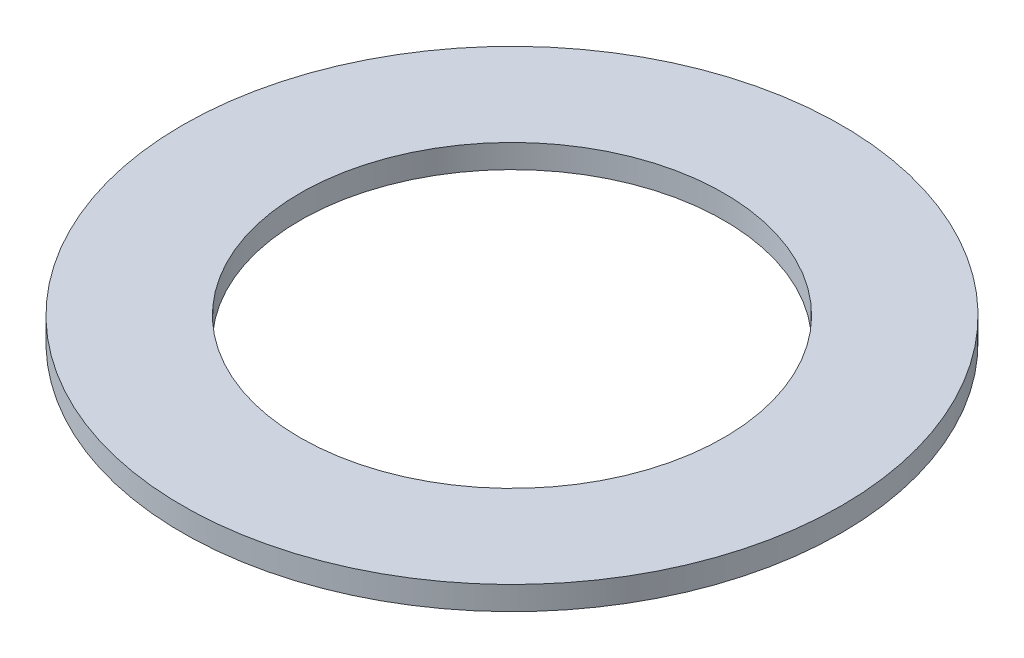
ISO-10303-21;
HEADER;
FILE_DESCRIPTION(('STEP AP214'),'2;1');
FILE_NAME('part.step','',(''),(''),'','','');
FILE_SCHEMA(('AUTOMOTIVE_DESIGN { 1 0 10303 214 1 1 1 1 }'));
ENDSEC;
DATA;
#1=APPLICATION_CONTEXT('core data for automotive mechanical design processes');
#2=APPLICATION_PROTOCOL_DEFINITION('international standard','automotive_design',2000,#1);
#3=PRODUCT_CONTEXT('',#1,'mechanical');
#4=PRODUCT('Part','Part','',(#3));
#5=PRODUCT_RELATED_PRODUCT_CATEGORY('part','',(#4));
#6=PRODUCT_DEFINITION_FORMATION('','',#4);
#7=PRODUCT_DEFINITION_CONTEXT('part definition',#1,'design');
#8=PRODUCT_DEFINITION('design','',#6,#7);
#9=PRODUCT_DEFINITION_SHAPE('','',#8);
#10=(LENGTH_UNIT() NAMED_UNIT(*) SI_UNIT(.MILLI.,.METRE.));
#11=(NAMED_UNIT(*) PLANE_ANGLE_UNIT() SI_UNIT($,.RADIAN.));
#12=(NAMED_UNIT(*) SI_UNIT($,.STERADIAN.) SOLID_ANGLE_UNIT());
#13=UNCERTAINTY_MEASURE_WITH_UNIT(LENGTH_MEASURE(1.E-05),#10,'distance_accuracy_value','');
#14=(GEOMETRIC_REPRESENTATION_CONTEXT(3) GLOBAL_UNCERTAINTY_ASSIGNED_CONTEXT((#13)) GLOBAL_UNIT_ASSIGNED_CONTEXT((#10,
#11,#12)) REPRESENTATION_CONTEXT('',''));
#15=CARTESIAN_POINT('',(0.,0.,0.));
#16=DIRECTION('',(0.,0.,1.));
#17=DIRECTION('',(1.,0.,0.));
#18=AXIS2_PLACEMENT_3D('',#15,#16,#17);
#19=CARTESIAN_POINT('',(0.,1.,0.));
#20=DIRECTION('',(0.,1.,0.));
#21=DIRECTION('',(0.,0.,1.));
#22=AXIS2_PLACEMENT_3D('',#19,#20,#21);
#23=PLANE('',#22);
#24=CARTESIAN_POINT('',(0.,1.,0.));
#25=DIRECTION('',(0.,1.,0.));
#26=DIRECTION('',(1.,0.,0.));
#27=AXIS2_PLACEMENT_3D('',#24,#25,#26);
#28=CIRCLE('',#27,14.);
#29=CARTESIAN_POINT('',(14.,1.,0.));
#30=VERTEX_POINT('',#29);
#31=EDGE_CURVE('E13',#30,#30,#28,.T.);
#32=ORIENTED_EDGE('',*,*,#31,.T.);
#33=EDGE_LOOP('',(#32));
#34=FACE_BOUND('',#33,.T.);
#35=CARTESIAN_POINT('',(0.,1.,0.));
#36=DIRECTION('',(0.,1.,0.));
#37=DIRECTION('',(0.,0.,1.));
#38=AXIS2_PLACEMENT_3D('',#35,#36,#37);
#39=CIRCLE('',#38,9.);
#40=CARTESIAN_POINT('',(0.,1.,9.));
#41=VERTEX_POINT('',#40);
#42=EDGE_CURVE('E59',#41,#41,#39,.T.);
#43=ORIENTED_EDGE('',*,*,#42,.F.);
#44=EDGE_LOOP('',(#43));
#45=FACE_BOUND('',#44,.T.);
#46=ADVANCED_FACE('F48',(#34,#45),#23,.T.);
#47=CARTESIAN_POINT('',(0.,0.,0.));
#48=DIRECTION('',(0.,1.,0.));
#49=DIRECTION('',(0.,0.,1.));
#50=AXIS2_PLACEMENT_3D('',#47,#48,#49);
#51=PLANE('',#50);
#52=CARTESIAN_POINT('',(0.,0.,0.));
#53=DIRECTION('',(0.,1.,0.));
#54=DIRECTION('',(1.,0.,0.));
#55=AXIS2_PLACEMENT_3D('',#52,#53,#54);
#56=CIRCLE('',#55,14.);
#57=CARTESIAN_POINT('',(14.,0.,0.));
#58=VERTEX_POINT('',#57);
#59=EDGE_CURVE('E52',#58,#58,#56,.T.);
#60=ORIENTED_EDGE('',*,*,#59,.F.);
#61=EDGE_LOOP('',(#60));
#62=FACE_BOUND('',#61,.T.);
#63=CARTESIAN_POINT('',(0.,0.,0.));
#64=DIRECTION('',(0.,1.,0.));
#65=DIRECTION('',(0.,0.,1.));
#66=AXIS2_PLACEMENT_3D('',#63,#64,#65);
#67=CIRCLE('',#66,9.);
#68=CARTESIAN_POINT('',(0.,0.,9.));
#69=VERTEX_POINT('',#68);
#70=EDGE_CURVE('E61',#69,#69,#67,.T.);
#71=ORIENTED_EDGE('',*,*,#70,.T.);
#72=EDGE_LOOP('',(#71));
#73=FACE_BOUND('',#72,.T.);
#74=ADVANCED_FACE('F71',(#62,#73),#51,.F.);
#75=CARTESIAN_POINT('',(0.,1.,0.));
#76=DIRECTION('',(0.,-1.,0.));
#77=DIRECTION('',(0.,0.,-1.));
#78=AXIS2_PLACEMENT_3D('',#75,#76,#77);
#79=CYLINDRICAL_SURFACE('',#78,14.);
#80=ORIENTED_EDGE('',*,*,#31,.F.);
#81=EDGE_LOOP('',(#80));
#82=FACE_BOUND('',#81,.T.);
#83=ORIENTED_EDGE('',*,*,#59,.T.);
#84=EDGE_LOOP('',(#83));
#85=FACE_BOUND('',#84,.T.);
#86=ADVANCED_FACE('F50',(#82,#85),#79,.T.);
#87=CARTESIAN_POINT('',(0.,1.,0.));
#88=DIRECTION('',(0.,-1.,0.));
#89=DIRECTION('',(0.,0.,-1.));
#90=AXIS2_PLACEMENT_3D('',#87,#88,#89);
#91=CYLINDRICAL_SURFACE('',#90,9.);
#92=ORIENTED_EDGE('',*,*,#42,.T.);
#93=EDGE_LOOP('',(#92));
#94=FACE_BOUND('',#93,.T.);
#95=ORIENTED_EDGE('',*,*,#70,.F.);
#96=EDGE_LOOP('',(#95));
#97=FACE_BOUND('',#96,.T.);
#98=ADVANCED_FACE('F67',(#94,#97),#91,.F.);
#99=CLOSED_SHELL('',(#46,#74,#86,#98));
#100=MANIFOLD_SOLID_BREP('B2',#99);
#101=ADVANCED_BREP_SHAPE_REPRESENTATION('',(#18,#100),#14);
#102=SHAPE_DEFINITION_REPRESENTATION(#9,#101);
ENDSEC;
END-ISO-10303-21;
